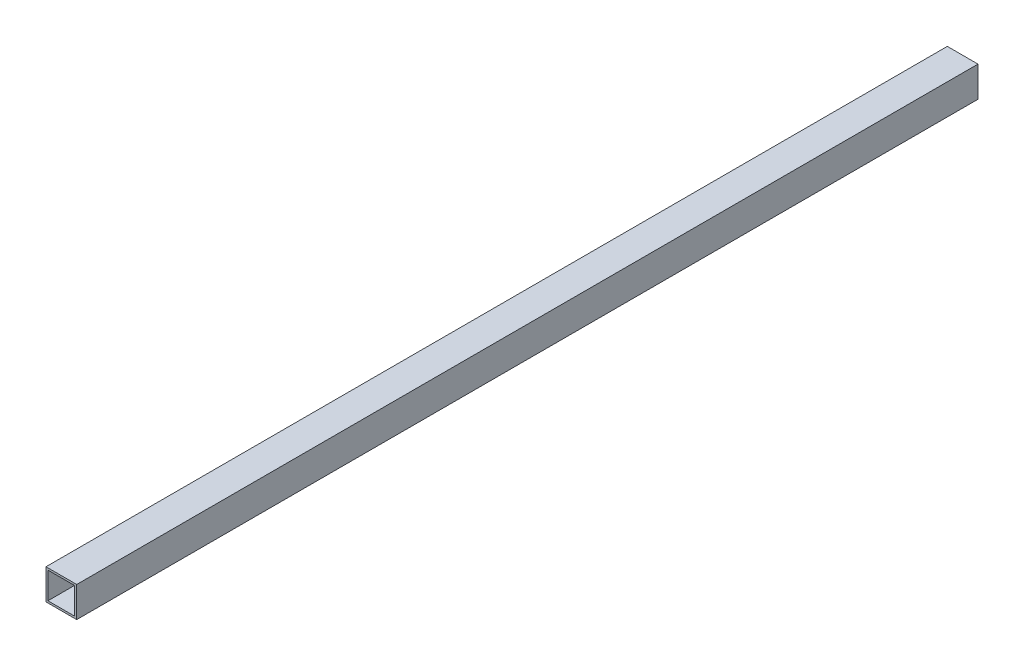
ISO-10303-21;
HEADER;
FILE_DESCRIPTION(('STEP AP214'),'2;1');
FILE_NAME('part.step','',(''),(''),'','','');
FILE_SCHEMA(('AUTOMOTIVE_DESIGN { 1 0 10303 214 1 1 1 1 }'));
ENDSEC;
DATA;
#1=APPLICATION_CONTEXT('core data for automotive mechanical design processes');
#2=APPLICATION_PROTOCOL_DEFINITION('international standard','automotive_design',2000,#1);
#3=PRODUCT_CONTEXT('',#1,'mechanical');
#4=PRODUCT('Part','Part','',(#3));
#5=PRODUCT_RELATED_PRODUCT_CATEGORY('part','',(#4));
#6=PRODUCT_DEFINITION_FORMATION('','',#4);
#7=PRODUCT_DEFINITION_CONTEXT('part definition',#1,'design');
#8=PRODUCT_DEFINITION('design','',#6,#7);
#9=PRODUCT_DEFINITION_SHAPE('','',#8);
#10=(LENGTH_UNIT() NAMED_UNIT(*) SI_UNIT(.MILLI.,.METRE.));
#11=(NAMED_UNIT(*) PLANE_ANGLE_UNIT() SI_UNIT($,.RADIAN.));
#12=(NAMED_UNIT(*) SI_UNIT($,.STERADIAN.) SOLID_ANGLE_UNIT());
#13=UNCERTAINTY_MEASURE_WITH_UNIT(LENGTH_MEASURE(1.E-05),#10,'distance_accuracy_value','');
#14=(GEOMETRIC_REPRESENTATION_CONTEXT(3) GLOBAL_UNCERTAINTY_ASSIGNED_CONTEXT((#13)) GLOBAL_UNIT_ASSIGNED_CONTEXT((#10,
#11,#12)) REPRESENTATION_CONTEXT('',''));
#15=CARTESIAN_POINT('',(0.,0.,0.));
#16=DIRECTION('',(0.,0.,1.));
#17=DIRECTION('',(1.,0.,0.));
#18=AXIS2_PLACEMENT_3D('',#15,#16,#17);
#19=CARTESIAN_POINT('',(-69.6345131491878,-40.2309443507589,1850.));
#20=DIRECTION('',(0.,0.,1.));
#21=DIRECTION('',(1.,0.,0.));
#22=AXIS2_PLACEMENT_3D('',#19,#20,#21);
#23=PLANE('',#22);
#24=DIRECTION('',(0.,-1.,0.));
#25=VECTOR('',#24,1.);
#26=CARTESIAN_POINT('',(-69.6345131491878,22.2690556492411,1850.));
#27=LINE('',#26,#25);
#28=CARTESIAN_POINT('',(-69.6345131491878,22.2690556492411,1850.));
#29=VERTEX_POINT('',#28);
#30=CARTESIAN_POINT('',(-69.6345131491878,-40.2309443507589,1850.));
#31=VERTEX_POINT('',#30);
#32=EDGE_CURVE('E133',#29,#31,#27,.T.);
#33=ORIENTED_EDGE('',*,*,#32,.T.);
#34=DIRECTION('',(1.,0.,0.));
#35=VECTOR('',#34,1.);
#36=CARTESIAN_POINT('',(-69.6345131491878,-40.2309443507589,1850.));
#37=LINE('',#36,#35);
#38=CARTESIAN_POINT('',(-6.63451314918777,-40.2309443507589,1850.));
#39=VERTEX_POINT('',#38);
#40=EDGE_CURVE('E136',#31,#39,#37,.T.);
#41=ORIENTED_EDGE('',*,*,#40,.T.);
#42=DIRECTION('',(0.,1.,0.));
#43=VECTOR('',#42,1.);
#44=CARTESIAN_POINT('',(-6.63451314918778,22.2690556492411,1850.));
#45=LINE('',#44,#43);
#46=CARTESIAN_POINT('',(-6.63451314918778,22.2690556492411,1850.));
#47=VERTEX_POINT('',#46);
#48=EDGE_CURVE('E139',#39,#47,#45,.T.);
#49=ORIENTED_EDGE('',*,*,#48,.T.);
#50=DIRECTION('',(-1.,0.,0.));
#51=VECTOR('',#50,1.);
#52=CARTESIAN_POINT('',(-69.6345131491878,22.2690556492411,1850.));
#53=LINE('',#52,#51);
#54=EDGE_CURVE('E141',#47,#29,#53,.T.);
#55=ORIENTED_EDGE('',*,*,#54,.T.);
#56=EDGE_LOOP('',(#33,#41,#49,#55));
#57=FACE_BOUND('',#56,.T.);
#58=DIRECTION('',(1.,0.,0.));
#59=VECTOR('',#58,1.);
#60=CARTESIAN_POINT('',(-65.6345131491878,-36.2309443507589,1850.));
#61=LINE('',#60,#59);
#62=CARTESIAN_POINT('',(-65.6345131491878,-36.2309443507589,1850.));
#63=VERTEX_POINT('',#62);
#64=CARTESIAN_POINT('',(-10.6345131491878,-36.2309443507589,1850.));
#65=VERTEX_POINT('',#64);
#66=EDGE_CURVE('E105',#63,#65,#61,.T.);
#67=ORIENTED_EDGE('',*,*,#66,.F.);
#68=DIRECTION('',(0.,-1.,0.));
#69=VECTOR('',#68,1.);
#70=CARTESIAN_POINT('',(-65.6345131491878,18.2690556492411,1850.));
#71=LINE('',#70,#69);
#72=CARTESIAN_POINT('',(-65.6345131491878,18.2690556492411,1850.));
#73=VERTEX_POINT('',#72);
#74=EDGE_CURVE('E97',#73,#63,#71,.T.);
#75=ORIENTED_EDGE('',*,*,#74,.F.);
#76=DIRECTION('',(-1.,0.,0.));
#77=VECTOR('',#76,1.);
#78=CARTESIAN_POINT('',(-65.6345131491878,18.2690556492411,1850.));
#79=LINE('',#78,#77);
#80=CARTESIAN_POINT('',(-10.6345131491878,18.2690556492411,1850.));
#81=VERTEX_POINT('',#80);
#82=EDGE_CURVE('E119',#81,#73,#79,.T.);
#83=ORIENTED_EDGE('',*,*,#82,.F.);
#84=DIRECTION('',(0.,1.,0.));
#85=VECTOR('',#84,1.);
#86=CARTESIAN_POINT('',(-10.6345131491878,18.2690556492411,1850.));
#87=LINE('',#86,#85);
#88=EDGE_CURVE('E117',#65,#81,#87,.T.);
#89=ORIENTED_EDGE('',*,*,#88,.F.);
#90=EDGE_LOOP('',(#67,#75,#83,#89));
#91=FACE_BOUND('',#90,.T.);
#92=ADVANCED_FACE('F32',(#57,#91),#23,.T.);
#93=CARTESIAN_POINT('',(-69.6345131491878,-40.2309443507589,0.));
#94=DIRECTION('',(0.,0.,1.));
#95=DIRECTION('',(1.,0.,0.));
#96=AXIS2_PLACEMENT_3D('',#93,#94,#95);
#97=PLANE('',#96);
#98=DIRECTION('',(0.,-1.,0.));
#99=VECTOR('',#98,1.);
#100=CARTESIAN_POINT('',(-69.6345131491878,22.2690556492411,0.));
#101=LINE('',#100,#99);
#102=CARTESIAN_POINT('',(-69.6345131491878,22.2690556492411,0.));
#103=VERTEX_POINT('',#102);
#104=CARTESIAN_POINT('',(-69.6345131491878,-40.2309443507589,0.));
#105=VERTEX_POINT('',#104);
#106=EDGE_CURVE('E113',#103,#105,#101,.T.);
#107=ORIENTED_EDGE('',*,*,#106,.F.);
#108=DIRECTION('',(-1.,0.,0.));
#109=VECTOR('',#108,1.);
#110=CARTESIAN_POINT('',(-69.6345131491878,22.2690556492411,0.));
#111=LINE('',#110,#109);
#112=CARTESIAN_POINT('',(-6.63451314918778,22.2690556492411,0.));
#113=VERTEX_POINT('',#112);
#114=EDGE_CURVE('E137',#113,#103,#111,.T.);
#115=ORIENTED_EDGE('',*,*,#114,.F.);
#116=DIRECTION('',(0.,1.,0.));
#117=VECTOR('',#116,1.);
#118=CARTESIAN_POINT('',(-6.63451314918778,22.2690556492411,0.));
#119=LINE('',#118,#117);
#120=CARTESIAN_POINT('',(-6.63451314918777,-40.2309443507589,0.));
#121=VERTEX_POINT('',#120);
#122=EDGE_CURVE('E148',#121,#113,#119,.T.);
#123=ORIENTED_EDGE('',*,*,#122,.F.);
#124=DIRECTION('',(1.,0.,0.));
#125=VECTOR('',#124,1.);
#126=CARTESIAN_POINT('',(-69.6345131491878,-40.2309443507589,0.));
#127=LINE('',#126,#125);
#128=EDGE_CURVE('E146',#105,#121,#127,.T.);
#129=ORIENTED_EDGE('',*,*,#128,.F.);
#130=EDGE_LOOP('',(#107,#115,#123,#129));
#131=FACE_BOUND('',#130,.T.);
#132=DIRECTION('',(0.,-1.,0.));
#133=VECTOR('',#132,1.);
#134=CARTESIAN_POINT('',(-65.6345131491878,18.2690556492411,0.));
#135=LINE('',#134,#133);
#136=CARTESIAN_POINT('',(-65.6345131491878,18.2690556492411,0.));
#137=VERTEX_POINT('',#136);
#138=CARTESIAN_POINT('',(-65.6345131491878,-36.2309443507589,0.));
#139=VERTEX_POINT('',#138);
#140=EDGE_CURVE('E55',#137,#139,#135,.T.);
#141=ORIENTED_EDGE('',*,*,#140,.T.);
#142=DIRECTION('',(1.,0.,0.));
#143=VECTOR('',#142,1.);
#144=CARTESIAN_POINT('',(-65.6345131491878,-36.2309443507589,0.));
#145=LINE('',#144,#143);
#146=CARTESIAN_POINT('',(-10.6345131491878,-36.2309443507589,0.));
#147=VERTEX_POINT('',#146);
#148=EDGE_CURVE('E112',#139,#147,#145,.T.);
#149=ORIENTED_EDGE('',*,*,#148,.T.);
#150=DIRECTION('',(0.,1.,0.));
#151=VECTOR('',#150,1.);
#152=CARTESIAN_POINT('',(-10.6345131491878,18.2690556492411,0.));
#153=LINE('',#152,#151);
#154=CARTESIAN_POINT('',(-10.6345131491878,18.2690556492411,0.));
#155=VERTEX_POINT('',#154);
#156=EDGE_CURVE('E125',#147,#155,#153,.T.);
#157=ORIENTED_EDGE('',*,*,#156,.T.);
#158=DIRECTION('',(-1.,0.,0.));
#159=VECTOR('',#158,1.);
#160=CARTESIAN_POINT('',(-65.6345131491878,18.2690556492411,0.));
#161=LINE('',#160,#159);
#162=EDGE_CURVE('E106',#155,#137,#161,.T.);
#163=ORIENTED_EDGE('',*,*,#162,.T.);
#164=EDGE_LOOP('',(#141,#149,#157,#163));
#165=FACE_BOUND('',#164,.T.);
#166=ADVANCED_FACE('F166',(#131,#165),#97,.F.);
#167=CARTESIAN_POINT('',(-69.6345131491878,22.2690556492411,1850.));
#168=DIRECTION('',(1.,0.,0.));
#169=DIRECTION('',(0.,1.,0.));
#170=AXIS2_PLACEMENT_3D('',#167,#168,#169);
#171=PLANE('',#170);
#172=ORIENTED_EDGE('',*,*,#106,.T.);
#173=DIRECTION('',(0.,0.,-1.));
#174=VECTOR('',#173,1.);
#175=CARTESIAN_POINT('',(-69.6345131491878,-40.2309443507589,1850.));
#176=LINE('',#175,#174);
#177=EDGE_CURVE('E11',#31,#105,#176,.T.);
#178=ORIENTED_EDGE('',*,*,#177,.F.);
#179=ORIENTED_EDGE('',*,*,#32,.F.);
#180=DIRECTION('',(0.,0.,-1.));
#181=VECTOR('',#180,1.);
#182=CARTESIAN_POINT('',(-69.6345131491878,22.2690556492411,1850.));
#183=LINE('',#182,#181);
#184=EDGE_CURVE('E143',#29,#103,#183,.T.);
#185=ORIENTED_EDGE('',*,*,#184,.T.);
#186=EDGE_LOOP('',(#172,#178,#179,#185));
#187=FACE_BOUND('',#186,.T.);
#188=ADVANCED_FACE('F34',(#187),#171,.F.);
#189=CARTESIAN_POINT('',(-69.6345131491878,-40.2309443507589,1850.));
#190=DIRECTION('',(0.,1.,0.));
#191=DIRECTION('',(0.,0.,1.));
#192=AXIS2_PLACEMENT_3D('',#189,#190,#191);
#193=PLANE('',#192);
#194=ORIENTED_EDGE('',*,*,#128,.T.);
#195=DIRECTION('',(0.,0.,-1.));
#196=VECTOR('',#195,1.);
#197=CARTESIAN_POINT('',(-6.63451314918777,-40.2309443507589,1850.));
#198=LINE('',#197,#196);
#199=EDGE_CURVE('E40',#39,#121,#198,.T.);
#200=ORIENTED_EDGE('',*,*,#199,.F.);
#201=ORIENTED_EDGE('',*,*,#40,.F.);
#202=ORIENTED_EDGE('',*,*,#177,.T.);
#203=EDGE_LOOP('',(#194,#200,#201,#202));
#204=FACE_BOUND('',#203,.T.);
#205=ADVANCED_FACE('F176',(#204),#193,.F.);
#206=CARTESIAN_POINT('',(-6.63451314918778,22.2690556492411,1850.));
#207=DIRECTION('',(-1.,0.,0.));
#208=DIRECTION('',(0.,-1.,0.));
#209=AXIS2_PLACEMENT_3D('',#206,#207,#208);
#210=PLANE('',#209);
#211=ORIENTED_EDGE('',*,*,#122,.T.);
#212=DIRECTION('',(0.,0.,-1.));
#213=VECTOR('',#212,1.);
#214=CARTESIAN_POINT('',(-6.63451314918778,22.2690556492411,1850.));
#215=LINE('',#214,#213);
#216=EDGE_CURVE('E153',#47,#113,#215,.T.);
#217=ORIENTED_EDGE('',*,*,#216,.F.);
#218=ORIENTED_EDGE('',*,*,#48,.F.);
#219=ORIENTED_EDGE('',*,*,#199,.T.);
#220=EDGE_LOOP('',(#211,#217,#218,#219));
#221=FACE_BOUND('',#220,.T.);
#222=ADVANCED_FACE('F160',(#221),#210,.F.);
#223=CARTESIAN_POINT('',(-69.6345131491878,22.2690556492411,1850.));
#224=DIRECTION('',(0.,-1.,0.));
#225=DIRECTION('',(0.,0.,-1.));
#226=AXIS2_PLACEMENT_3D('',#223,#224,#225);
#227=PLANE('',#226);
#228=ORIENTED_EDGE('',*,*,#114,.T.);
#229=ORIENTED_EDGE('',*,*,#184,.F.);
#230=ORIENTED_EDGE('',*,*,#54,.F.);
#231=ORIENTED_EDGE('',*,*,#216,.T.);
#232=EDGE_LOOP('',(#228,#229,#230,#231));
#233=FACE_BOUND('',#232,.T.);
#234=ADVANCED_FACE('F170',(#233),#227,.F.);
#235=CARTESIAN_POINT('',(-65.6345131491878,18.2690556492411,1850.));
#236=DIRECTION('',(1.,0.,0.));
#237=DIRECTION('',(0.,1.,0.));
#238=AXIS2_PLACEMENT_3D('',#235,#236,#237);
#239=PLANE('',#238);
#240=ORIENTED_EDGE('',*,*,#140,.F.);
#241=DIRECTION('',(0.,0.,-1.));
#242=VECTOR('',#241,1.);
#243=CARTESIAN_POINT('',(-65.6345131491878,18.2690556492411,1850.));
#244=LINE('',#243,#242);
#245=EDGE_CURVE('E101',#73,#137,#244,.T.);
#246=ORIENTED_EDGE('',*,*,#245,.F.);
#247=ORIENTED_EDGE('',*,*,#74,.T.);
#248=DIRECTION('',(0.,0.,-1.));
#249=VECTOR('',#248,1.);
#250=CARTESIAN_POINT('',(-65.6345131491878,-36.2309443507589,1850.));
#251=LINE('',#250,#249);
#252=EDGE_CURVE('E100',#63,#139,#251,.T.);
#253=ORIENTED_EDGE('',*,*,#252,.T.);
#254=EDGE_LOOP('',(#240,#246,#247,#253));
#255=FACE_BOUND('',#254,.T.);
#256=ADVANCED_FACE('F99',(#255),#239,.T.);
#257=CARTESIAN_POINT('',(-65.6345131491878,-36.2309443507589,1850.));
#258=DIRECTION('',(0.,1.,0.));
#259=DIRECTION('',(0.,0.,1.));
#260=AXIS2_PLACEMENT_3D('',#257,#258,#259);
#261=PLANE('',#260);
#262=ORIENTED_EDGE('',*,*,#148,.F.);
#263=ORIENTED_EDGE('',*,*,#252,.F.);
#264=ORIENTED_EDGE('',*,*,#66,.T.);
#265=DIRECTION('',(0.,0.,-1.));
#266=VECTOR('',#265,1.);
#267=CARTESIAN_POINT('',(-10.6345131491878,-36.2309443507589,1850.));
#268=LINE('',#267,#266);
#269=EDGE_CURVE('E114',#65,#147,#268,.T.);
#270=ORIENTED_EDGE('',*,*,#269,.T.);
#271=EDGE_LOOP('',(#262,#263,#264,#270));
#272=FACE_BOUND('',#271,.T.);
#273=ADVANCED_FACE('F109',(#272),#261,.T.);
#274=CARTESIAN_POINT('',(-10.6345131491878,18.2690556492411,1850.));
#275=DIRECTION('',(-1.,0.,0.));
#276=DIRECTION('',(0.,-1.,0.));
#277=AXIS2_PLACEMENT_3D('',#274,#275,#276);
#278=PLANE('',#277);
#279=ORIENTED_EDGE('',*,*,#156,.F.);
#280=ORIENTED_EDGE('',*,*,#269,.F.);
#281=ORIENTED_EDGE('',*,*,#88,.T.);
#282=DIRECTION('',(0.,0.,-1.));
#283=VECTOR('',#282,1.);
#284=CARTESIAN_POINT('',(-10.6345131491878,18.2690556492411,1850.));
#285=LINE('',#284,#283);
#286=EDGE_CURVE('E47',#81,#155,#285,.T.);
#287=ORIENTED_EDGE('',*,*,#286,.T.);
#288=EDGE_LOOP('',(#279,#280,#281,#287));
#289=FACE_BOUND('',#288,.T.);
#290=ADVANCED_FACE('F199',(#289),#278,.T.);
#291=CARTESIAN_POINT('',(-65.6345131491878,18.2690556492411,1850.));
#292=DIRECTION('',(0.,-1.,0.));
#293=DIRECTION('',(1.,0.,0.));
#294=AXIS2_PLACEMENT_3D('',#291,#292,#293);
#295=PLANE('',#294);
#296=ORIENTED_EDGE('',*,*,#162,.F.);
#297=ORIENTED_EDGE('',*,*,#286,.F.);
#298=ORIENTED_EDGE('',*,*,#82,.T.);
#299=ORIENTED_EDGE('',*,*,#245,.T.);
#300=EDGE_LOOP('',(#296,#297,#298,#299));
#301=FACE_BOUND('',#300,.T.);
#302=ADVANCED_FACE('F203',(#301),#295,.T.);
#303=CLOSED_SHELL('',(#92,#166,#188,#205,#222,#234,#256,#273,#290,#302));
#304=MANIFOLD_SOLID_BREP('B2',#303);
#305=ADVANCED_BREP_SHAPE_REPRESENTATION('',(#18,#304),#14);
#306=SHAPE_DEFINITION_REPRESENTATION(#9,#305);
ENDSEC;
END-ISO-10303-21;
